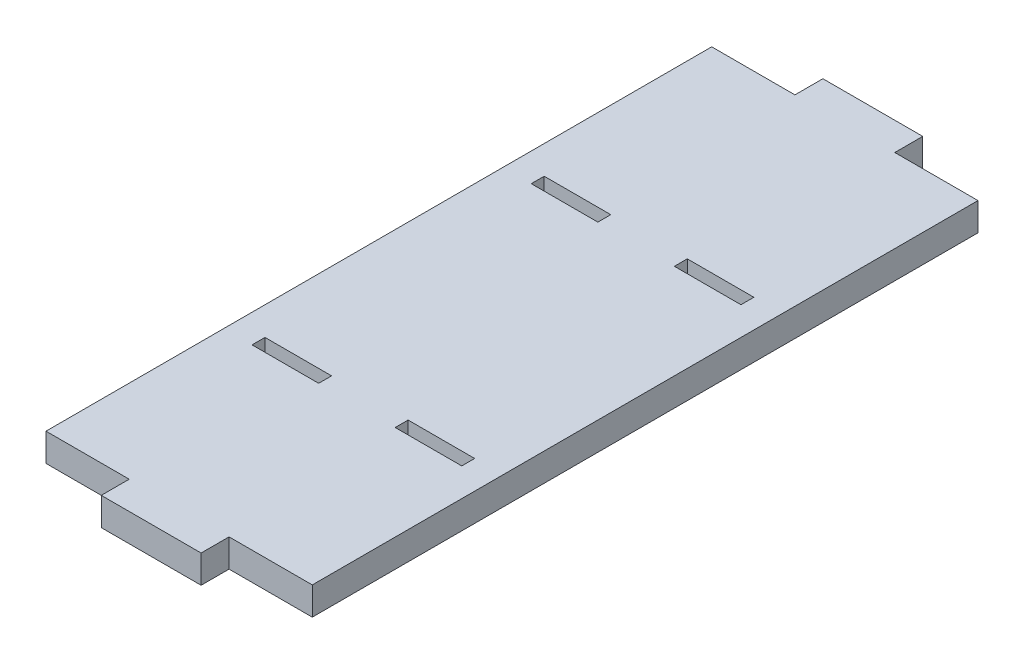
ISO-10303-21;
HEADER;
FILE_DESCRIPTION(('STEP AP214'),'2;1');
FILE_NAME('part.step','',(''),(''),'','','');
FILE_SCHEMA(('AUTOMOTIVE_DESIGN { 1 0 10303 214 1 1 1 1 }'));
ENDSEC;
DATA;
#1=APPLICATION_CONTEXT('core data for automotive mechanical design processes');
#2=APPLICATION_PROTOCOL_DEFINITION('international standard','automotive_design',2000,#1);
#3=PRODUCT_CONTEXT('',#1,'mechanical');
#4=PRODUCT('Part','Part','',(#3));
#5=PRODUCT_RELATED_PRODUCT_CATEGORY('part','',(#4));
#6=PRODUCT_DEFINITION_FORMATION('','',#4);
#7=PRODUCT_DEFINITION_CONTEXT('part definition',#1,'design');
#8=PRODUCT_DEFINITION('design','',#6,#7);
#9=PRODUCT_DEFINITION_SHAPE('','',#8);
#10=(LENGTH_UNIT() NAMED_UNIT(*) SI_UNIT(.MILLI.,.METRE.));
#11=(NAMED_UNIT(*) PLANE_ANGLE_UNIT() SI_UNIT($,.RADIAN.));
#12=(NAMED_UNIT(*) SI_UNIT($,.STERADIAN.) SOLID_ANGLE_UNIT());
#13=UNCERTAINTY_MEASURE_WITH_UNIT(LENGTH_MEASURE(1.E-05),#10,'distance_accuracy_value','');
#14=(GEOMETRIC_REPRESENTATION_CONTEXT(3) GLOBAL_UNCERTAINTY_ASSIGNED_CONTEXT((#13)) GLOBAL_UNIT_ASSIGNED_CONTEXT((#10,
#11,#12)) REPRESENTATION_CONTEXT('',''));
#15=CARTESIAN_POINT('',(0.,0.,0.));
#16=DIRECTION('',(0.,0.,1.));
#17=DIRECTION('',(1.,0.,0.));
#18=AXIS2_PLACEMENT_3D('',#15,#16,#17);
#19=CARTESIAN_POINT('',(0.,5.334,-127.));
#20=DIRECTION('',(0.,0.,1.));
#21=DIRECTION('',(1.,0.,0.));
#22=AXIS2_PLACEMENT_3D('',#19,#20,#21);
#23=PLANE('',#22);
#24=DIRECTION('',(-1.,0.,0.));
#25=VECTOR('',#24,1.);
#26=CARTESIAN_POINT('',(0.,5.334,-127.));
#27=LINE('',#26,#25);
#28=CARTESIAN_POINT('',(15.875,5.334,-127.));
#29=VERTEX_POINT('',#28);
#30=CARTESIAN_POINT('',(0.,5.334,-127.));
#31=VERTEX_POINT('',#30);
#32=EDGE_CURVE('E407',#29,#31,#27,.T.);
#33=ORIENTED_EDGE('',*,*,#32,.F.);
#34=DIRECTION('',(0.,-1.,0.));
#35=VECTOR('',#34,1.);
#36=CARTESIAN_POINT('',(15.875,0.,-127.));
#37=LINE('',#36,#35);
#38=CARTESIAN_POINT('',(15.875,0.,-127.));
#39=VERTEX_POINT('',#38);
#40=EDGE_CURVE('E352',#29,#39,#37,.T.);
#41=ORIENTED_EDGE('',*,*,#40,.T.);
#42=DIRECTION('',(-1.,0.,0.));
#43=VECTOR('',#42,1.);
#44=CARTESIAN_POINT('',(0.,0.,-127.));
#45=LINE('',#44,#43);
#46=CARTESIAN_POINT('',(0.,0.,-127.));
#47=VERTEX_POINT('',#46);
#48=EDGE_CURVE('E405',#39,#47,#45,.T.);
#49=ORIENTED_EDGE('',*,*,#48,.T.);
#50=DIRECTION('',(0.,-1.,0.));
#51=VECTOR('',#50,1.);
#52=CARTESIAN_POINT('',(0.,5.334,-127.));
#53=LINE('',#52,#51);
#54=EDGE_CURVE('E427',#31,#47,#53,.T.);
#55=ORIENTED_EDGE('',*,*,#54,.F.);
#56=EDGE_LOOP('',(#33,#41,#49,#55));
#57=FACE_BOUND('',#56,.T.);
#58=ADVANCED_FACE('F32',(#57),#23,.F.);
#59=CARTESIAN_POINT('',(0.,5.334,0.));
#60=DIRECTION('',(0.,0.,-1.));
#61=DIRECTION('',(-1.,0.,0.));
#62=AXIS2_PLACEMENT_3D('',#59,#60,#61);
#63=PLANE('',#62);
#64=DIRECTION('',(0.,-1.,0.));
#65=VECTOR('',#64,1.);
#66=CARTESIAN_POINT('',(15.875,0.,0.));
#67=LINE('',#66,#65);
#68=CARTESIAN_POINT('',(15.875,5.334,0.));
#69=VERTEX_POINT('',#68);
#70=CARTESIAN_POINT('',(15.875,0.,0.));
#71=VERTEX_POINT('',#70);
#72=EDGE_CURVE('E377',#69,#71,#67,.T.);
#73=ORIENTED_EDGE('',*,*,#72,.F.);
#74=DIRECTION('',(1.,0.,0.));
#75=VECTOR('',#74,1.);
#76=CARTESIAN_POINT('',(0.,5.334,0.));
#77=LINE('',#76,#75);
#78=CARTESIAN_POINT('',(0.,5.334,0.));
#79=VERTEX_POINT('',#78);
#80=EDGE_CURVE('E449',#79,#69,#77,.T.);
#81=ORIENTED_EDGE('',*,*,#80,.F.);
#82=DIRECTION('',(0.,-1.,0.));
#83=VECTOR('',#82,1.);
#84=CARTESIAN_POINT('',(0.,5.334,0.));
#85=LINE('',#84,#83);
#86=CARTESIAN_POINT('',(0.,0.,0.));
#87=VERTEX_POINT('',#86);
#88=EDGE_CURVE('E11',#79,#87,#85,.T.);
#89=ORIENTED_EDGE('',*,*,#88,.T.);
#90=DIRECTION('',(1.,0.,0.));
#91=VECTOR('',#90,1.);
#92=CARTESIAN_POINT('',(0.,0.,0.));
#93=LINE('',#92,#91);
#94=EDGE_CURVE('E417',#87,#71,#93,.T.);
#95=ORIENTED_EDGE('',*,*,#94,.T.);
#96=EDGE_LOOP('',(#73,#81,#89,#95));
#97=FACE_BOUND('',#96,.T.);
#98=ADVANCED_FACE('F523',(#97),#63,.F.);
#99=DIRECTION('',(0.,1.,0.));
#100=VECTOR('',#99,1.);
#101=CARTESIAN_POINT('',(34.925,0.,0.));
#102=LINE('',#101,#100);
#103=CARTESIAN_POINT('',(34.925,0.,0.));
#104=VERTEX_POINT('',#103);
#105=CARTESIAN_POINT('',(34.925,5.334,0.));
#106=VERTEX_POINT('',#105);
#107=EDGE_CURVE('E382',#104,#106,#102,.T.);
#108=ORIENTED_EDGE('',*,*,#107,.F.);
#109=CARTESIAN_POINT('',(50.8,0.,0.));
#110=VERTEX_POINT('',#109);
#111=EDGE_CURVE('E436',#104,#110,#93,.T.);
#112=ORIENTED_EDGE('',*,*,#111,.T.);
#113=DIRECTION('',(0.,-1.,0.));
#114=VECTOR('',#113,1.);
#115=CARTESIAN_POINT('',(50.8,5.334,0.));
#116=LINE('',#115,#114);
#117=CARTESIAN_POINT('',(50.8,5.334,0.));
#118=VERTEX_POINT('',#117);
#119=EDGE_CURVE('E41',#118,#110,#116,.T.);
#120=ORIENTED_EDGE('',*,*,#119,.F.);
#121=EDGE_CURVE('E453',#106,#118,#77,.T.);
#122=ORIENTED_EDGE('',*,*,#121,.F.);
#123=EDGE_LOOP('',(#108,#112,#120,#122));
#124=FACE_BOUND('',#123,.T.);
#125=ADVANCED_FACE('F527',(#124),#63,.F.);
#126=CARTESIAN_POINT('',(0.,5.334,0.));
#127=DIRECTION('',(1.,0.,0.));
#128=DIRECTION('',(0.,0.,-1.));
#129=AXIS2_PLACEMENT_3D('',#126,#127,#128);
#130=PLANE('',#129);
#131=DIRECTION('',(0.,0.,1.));
#132=VECTOR('',#131,1.);
#133=CARTESIAN_POINT('',(0.,0.,0.));
#134=LINE('',#133,#132);
#135=EDGE_CURVE('E410',#47,#87,#134,.T.);
#136=ORIENTED_EDGE('',*,*,#135,.T.);
#137=ORIENTED_EDGE('',*,*,#88,.F.);
#138=DIRECTION('',(0.,0.,1.));
#139=VECTOR('',#138,1.);
#140=CARTESIAN_POINT('',(0.,5.334,0.));
#141=LINE('',#140,#139);
#142=EDGE_CURVE('E415',#31,#79,#141,.T.);
#143=ORIENTED_EDGE('',*,*,#142,.F.);
#144=ORIENTED_EDGE('',*,*,#54,.T.);
#145=EDGE_LOOP('',(#136,#137,#143,#144));
#146=FACE_BOUND('',#145,.T.);
#147=ADVANCED_FACE('F34',(#146),#130,.F.);
#148=CARTESIAN_POINT('',(50.8,5.334,0.));
#149=DIRECTION('',(-1.,0.,0.));
#150=DIRECTION('',(0.,0.,1.));
#151=AXIS2_PLACEMENT_3D('',#148,#149,#150);
#152=PLANE('',#151);
#153=DIRECTION('',(0.,0.,-1.));
#154=VECTOR('',#153,1.);
#155=CARTESIAN_POINT('',(50.8,0.,0.));
#156=LINE('',#155,#154);
#157=CARTESIAN_POINT('',(50.8,0.,-127.));
#158=VERTEX_POINT('',#157);
#159=EDGE_CURVE('E412',#110,#158,#156,.T.);
#160=ORIENTED_EDGE('',*,*,#159,.T.);
#161=DIRECTION('',(0.,-1.,0.));
#162=VECTOR('',#161,1.);
#163=CARTESIAN_POINT('',(50.8,5.334,-127.));
#164=LINE('',#163,#162);
#165=CARTESIAN_POINT('',(50.8,5.334,-127.));
#166=VERTEX_POINT('',#165);
#167=EDGE_CURVE('E430',#166,#158,#164,.T.);
#168=ORIENTED_EDGE('',*,*,#167,.F.);
#169=DIRECTION('',(0.,0.,-1.));
#170=VECTOR('',#169,1.);
#171=CARTESIAN_POINT('',(50.8,5.334,0.));
#172=LINE('',#171,#170);
#173=EDGE_CURVE('E444',#118,#166,#172,.T.);
#174=ORIENTED_EDGE('',*,*,#173,.F.);
#175=ORIENTED_EDGE('',*,*,#119,.T.);
#176=EDGE_LOOP('',(#160,#168,#174,#175));
#177=FACE_BOUND('',#176,.T.);
#178=ADVANCED_FACE('F517',(#177),#152,.F.);
#179=CARTESIAN_POINT('',(34.925,0.,-127.));
#180=VERTEX_POINT('',#179);
#181=EDGE_CURVE('E411',#158,#180,#45,.T.);
#182=ORIENTED_EDGE('',*,*,#181,.T.);
#183=DIRECTION('',(0.,1.,0.));
#184=VECTOR('',#183,1.);
#185=CARTESIAN_POINT('',(34.925,0.,-127.));
#186=LINE('',#185,#184);
#187=CARTESIAN_POINT('',(34.925,5.334,-127.));
#188=VERTEX_POINT('',#187);
#189=EDGE_CURVE('E357',#180,#188,#186,.T.);
#190=ORIENTED_EDGE('',*,*,#189,.T.);
#191=EDGE_CURVE('E422',#166,#188,#27,.T.);
#192=ORIENTED_EDGE('',*,*,#191,.F.);
#193=ORIENTED_EDGE('',*,*,#167,.T.);
#194=EDGE_LOOP('',(#182,#190,#192,#193));
#195=FACE_BOUND('',#194,.T.);
#196=ADVANCED_FACE('F509',(#195),#23,.F.);
#197=CARTESIAN_POINT('',(0.,5.334,0.));
#198=DIRECTION('',(0.,-1.,0.));
#199=DIRECTION('',(0.,0.,-1.));
#200=AXIS2_PLACEMENT_3D('',#197,#198,#199);
#201=PLANE('',#200);
#202=DIRECTION('',(0.,0.,-1.));
#203=VECTOR('',#202,1.);
#204=CARTESIAN_POINT('',(32.7,5.334,0.));
#205=LINE('',#204,#203);
#206=CARTESIAN_POINT('',(32.7,5.334,-87.1773534988727));
#207=VERTEX_POINT('',#206);
#208=CARTESIAN_POINT('',(32.7,5.334,-89.6411534988727));
#209=VERTEX_POINT('',#208);
#210=EDGE_CURVE('E250',#207,#209,#205,.T.);
#211=ORIENTED_EDGE('',*,*,#210,.T.);
#212=DIRECTION('',(1.,0.,0.));
#213=VECTOR('',#212,1.);
#214=CARTESIAN_POINT('',(0.,5.334,-89.6411534988727));
#215=LINE('',#214,#213);
#216=CARTESIAN_POINT('',(45.4,5.334,-89.6411534988727));
#217=VERTEX_POINT('',#216);
#218=EDGE_CURVE('E253',#209,#217,#215,.T.);
#219=ORIENTED_EDGE('',*,*,#218,.T.);
#220=DIRECTION('',(0.,0.,1.));
#221=VECTOR('',#220,1.);
#222=CARTESIAN_POINT('',(45.4,5.334,0.));
#223=LINE('',#222,#221);
#224=CARTESIAN_POINT('',(45.4,5.334,-87.1773534988727));
#225=VERTEX_POINT('',#224);
#226=EDGE_CURVE('E245',#217,#225,#223,.T.);
#227=ORIENTED_EDGE('',*,*,#226,.T.);
#228=DIRECTION('',(-1.,0.,0.));
#229=VECTOR('',#228,1.);
#230=CARTESIAN_POINT('',(0.,5.334,-87.1773534988727));
#231=LINE('',#230,#229);
#232=EDGE_CURVE('E225',#225,#207,#231,.T.);
#233=ORIENTED_EDGE('',*,*,#232,.T.);
#234=EDGE_LOOP('',(#211,#219,#227,#233));
#235=FACE_BOUND('',#234,.T.);
#236=DIRECTION('',(0.,0.,1.));
#237=VECTOR('',#236,1.);
#238=CARTESIAN_POINT('',(18.1,5.334,0.));
#239=LINE('',#238,#237);
#240=CARTESIAN_POINT('',(18.1,5.334,-89.6411534988727));
#241=VERTEX_POINT('',#240);
#242=CARTESIAN_POINT('',(18.1,5.334,-87.1773534988727));
#243=VERTEX_POINT('',#242);
#244=EDGE_CURVE('E282',#241,#243,#239,.T.);
#245=ORIENTED_EDGE('',*,*,#244,.T.);
#246=DIRECTION('',(-1.,0.,0.));
#247=VECTOR('',#246,1.);
#248=CARTESIAN_POINT('',(0.,5.334,-87.1773534988727));
#249=LINE('',#248,#247);
#250=CARTESIAN_POINT('',(5.39999999999997,5.334,-87.1773534988727));
#251=VERTEX_POINT('',#250);
#252=EDGE_CURVE('E285',#243,#251,#249,.T.);
#253=ORIENTED_EDGE('',*,*,#252,.T.);
#254=DIRECTION('',(0.,0.,-1.));
#255=VECTOR('',#254,1.);
#256=CARTESIAN_POINT('',(5.39999999999997,5.334,0.));
#257=LINE('',#256,#255);
#258=CARTESIAN_POINT('',(5.39999999999997,5.334,-89.6411534988727));
#259=VERTEX_POINT('',#258);
#260=EDGE_CURVE('E270',#251,#259,#257,.T.);
#261=ORIENTED_EDGE('',*,*,#260,.T.);
#262=DIRECTION('',(1.,0.,0.));
#263=VECTOR('',#262,1.);
#264=CARTESIAN_POINT('',(0.,5.334,-89.6411534988727));
#265=LINE('',#264,#263);
#266=EDGE_CURVE('E279',#259,#241,#265,.T.);
#267=ORIENTED_EDGE('',*,*,#266,.T.);
#268=EDGE_LOOP('',(#245,#253,#261,#267));
#269=FACE_BOUND('',#268,.T.);
#270=DIRECTION('',(0.,0.,-1.));
#271=VECTOR('',#270,1.);
#272=CARTESIAN_POINT('',(32.7,5.334,0.));
#273=LINE('',#272,#271);
#274=CARTESIAN_POINT('',(32.7,5.334,-33.9135534988727));
#275=VERTEX_POINT('',#274);
#276=CARTESIAN_POINT('',(32.7,5.334,-36.3773534988727));
#277=VERTEX_POINT('',#276);
#278=EDGE_CURVE('E314',#275,#277,#273,.T.);
#279=ORIENTED_EDGE('',*,*,#278,.T.);
#280=DIRECTION('',(1.,0.,0.));
#281=VECTOR('',#280,1.);
#282=CARTESIAN_POINT('',(0.,5.334,-36.3773534988727));
#283=LINE('',#282,#281);
#284=CARTESIAN_POINT('',(45.4,5.334,-36.3773534988727));
#285=VERTEX_POINT('',#284);
#286=EDGE_CURVE('E317',#277,#285,#283,.T.);
#287=ORIENTED_EDGE('',*,*,#286,.T.);
#288=DIRECTION('',(0.,0.,1.));
#289=VECTOR('',#288,1.);
#290=CARTESIAN_POINT('',(45.4,5.334,0.));
#291=LINE('',#290,#289);
#292=CARTESIAN_POINT('',(45.4,5.334,-33.9135534988727));
#293=VERTEX_POINT('',#292);
#294=EDGE_CURVE('E302',#285,#293,#291,.T.);
#295=ORIENTED_EDGE('',*,*,#294,.T.);
#296=DIRECTION('',(-1.,0.,0.));
#297=VECTOR('',#296,1.);
#298=CARTESIAN_POINT('',(0.,5.334,-33.9135534988727));
#299=LINE('',#298,#297);
#300=EDGE_CURVE('E311',#293,#275,#299,.T.);
#301=ORIENTED_EDGE('',*,*,#300,.T.);
#302=EDGE_LOOP('',(#279,#287,#295,#301));
#303=FACE_BOUND('',#302,.T.);
#304=DIRECTION('',(0.,0.,1.));
#305=VECTOR('',#304,1.);
#306=CARTESIAN_POINT('',(18.1,5.334,0.));
#307=LINE('',#306,#305);
#308=CARTESIAN_POINT('',(18.1,5.334,-36.3773534988727));
#309=VERTEX_POINT('',#308);
#310=CARTESIAN_POINT('',(18.1,5.334,-33.9135534988727));
#311=VERTEX_POINT('',#310);
#312=EDGE_CURVE('E346',#309,#311,#307,.T.);
#313=ORIENTED_EDGE('',*,*,#312,.T.);
#314=DIRECTION('',(-1.,0.,0.));
#315=VECTOR('',#314,1.);
#316=CARTESIAN_POINT('',(0.,5.334,-33.9135534988727));
#317=LINE('',#316,#315);
#318=CARTESIAN_POINT('',(5.39999999999998,5.334,-33.9135534988727));
#319=VERTEX_POINT('',#318);
#320=EDGE_CURVE('E349',#311,#319,#317,.T.);
#321=ORIENTED_EDGE('',*,*,#320,.T.);
#322=DIRECTION('',(0.,0.,-1.));
#323=VECTOR('',#322,1.);
#324=CARTESIAN_POINT('',(5.39999999999998,5.334,0.));
#325=LINE('',#324,#323);
#326=CARTESIAN_POINT('',(5.39999999999998,5.334,-36.3773534988727));
#327=VERTEX_POINT('',#326);
#328=EDGE_CURVE('E334',#319,#327,#325,.T.);
#329=ORIENTED_EDGE('',*,*,#328,.T.);
#330=DIRECTION('',(1.,0.,0.));
#331=VECTOR('',#330,1.);
#332=CARTESIAN_POINT('',(0.,5.334,-36.3773534988727));
#333=LINE('',#332,#331);
#334=EDGE_CURVE('E343',#327,#309,#333,.T.);
#335=ORIENTED_EDGE('',*,*,#334,.T.);
#336=EDGE_LOOP('',(#313,#321,#329,#335));
#337=FACE_BOUND('',#336,.T.);
#338=ORIENTED_EDGE('',*,*,#142,.T.);
#339=ORIENTED_EDGE('',*,*,#80,.T.);
#340=DIRECTION('',(0.,0.,-1.));
#341=VECTOR('',#340,1.);
#342=CARTESIAN_POINT('',(15.875,5.334,5.334));
#343=LINE('',#342,#341);
#344=CARTESIAN_POINT('',(15.875,5.334,5.334));
#345=VERTEX_POINT('',#344);
#346=EDGE_CURVE('E473',#345,#69,#343,.T.);
#347=ORIENTED_EDGE('',*,*,#346,.F.);
#348=DIRECTION('',(-1.,0.,0.));
#349=VECTOR('',#348,1.);
#350=CARTESIAN_POINT('',(15.875,5.334,5.334));
#351=LINE('',#350,#349);
#352=CARTESIAN_POINT('',(34.925,5.334,5.334));
#353=VERTEX_POINT('',#352);
#354=EDGE_CURVE('E484',#353,#345,#351,.T.);
#355=ORIENTED_EDGE('',*,*,#354,.F.);
#356=DIRECTION('',(0.,0.,-1.));
#357=VECTOR('',#356,1.);
#358=CARTESIAN_POINT('',(34.925,5.334,5.334));
#359=LINE('',#358,#357);
#360=EDGE_CURVE('E469',#353,#106,#359,.T.);
#361=ORIENTED_EDGE('',*,*,#360,.T.);
#362=ORIENTED_EDGE('',*,*,#121,.T.);
#363=ORIENTED_EDGE('',*,*,#173,.T.);
#364=ORIENTED_EDGE('',*,*,#191,.T.);
#365=DIRECTION('',(0.,0.,1.));
#366=VECTOR('',#365,1.);
#367=CARTESIAN_POINT('',(34.925,5.334,-132.334));
#368=LINE('',#367,#366);
#369=CARTESIAN_POINT('',(34.925,5.334,-132.334));
#370=VERTEX_POINT('',#369);
#371=EDGE_CURVE('E378',#370,#188,#368,.T.);
#372=ORIENTED_EDGE('',*,*,#371,.F.);
#373=DIRECTION('',(-1.,0.,0.));
#374=VECTOR('',#373,1.);
#375=CARTESIAN_POINT('',(15.875,5.334,-132.334));
#376=LINE('',#375,#374);
#377=CARTESIAN_POINT('',(15.875,5.334,-132.334));
#378=VERTEX_POINT('',#377);
#379=EDGE_CURVE('E356',#370,#378,#376,.T.);
#380=ORIENTED_EDGE('',*,*,#379,.T.);
#381=DIRECTION('',(0.,0.,1.));
#382=VECTOR('',#381,1.);
#383=CARTESIAN_POINT('',(15.875,5.334,-132.334));
#384=LINE('',#383,#382);
#385=EDGE_CURVE('E376',#378,#29,#384,.T.);
#386=ORIENTED_EDGE('',*,*,#385,.T.);
#387=ORIENTED_EDGE('',*,*,#32,.T.);
#388=EDGE_LOOP('',(#338,#339,#347,#355,#361,#362,#363,#364,#372,#380,#386,#387));
#389=FACE_BOUND('',#388,.T.);
#390=ADVANCED_FACE('F505',(#235,#269,#303,#337,#389),#201,.F.);
#391=CARTESIAN_POINT('',(0.,0.,0.));
#392=DIRECTION('',(0.,-1.,0.));
#393=DIRECTION('',(0.,0.,-1.));
#394=AXIS2_PLACEMENT_3D('',#391,#392,#393);
#395=PLANE('',#394);
#396=DIRECTION('',(1.,0.,0.));
#397=VECTOR('',#396,1.);
#398=CARTESIAN_POINT('',(32.7,0.,-89.6411534988727));
#399=LINE('',#398,#397);
#400=CARTESIAN_POINT('',(32.7,0.,-89.6411534988727));
#401=VERTEX_POINT('',#400);
#402=CARTESIAN_POINT('',(45.4,0.,-89.6411534988727));
#403=VERTEX_POINT('',#402);
#404=EDGE_CURVE('E57',#401,#403,#399,.T.);
#405=ORIENTED_EDGE('',*,*,#404,.F.);
#406=DIRECTION('',(0.,0.,-1.));
#407=VECTOR('',#406,1.);
#408=CARTESIAN_POINT('',(32.7,0.,-87.1773534988727));
#409=LINE('',#408,#407);
#410=CARTESIAN_POINT('',(32.7,0.,-87.1773534988727));
#411=VERTEX_POINT('',#410);
#412=EDGE_CURVE('E238',#411,#401,#409,.T.);
#413=ORIENTED_EDGE('',*,*,#412,.F.);
#414=DIRECTION('',(-1.,0.,0.));
#415=VECTOR('',#414,1.);
#416=CARTESIAN_POINT('',(45.4,0.,-87.1773534988727));
#417=LINE('',#416,#415);
#418=CARTESIAN_POINT('',(45.4,0.,-87.1773534988727));
#419=VERTEX_POINT('',#418);
#420=EDGE_CURVE('E222',#419,#411,#417,.T.);
#421=ORIENTED_EDGE('',*,*,#420,.F.);
#422=DIRECTION('',(0.,0.,1.));
#423=VECTOR('',#422,1.);
#424=CARTESIAN_POINT('',(45.4,0.,-89.6411534988727));
#425=LINE('',#424,#423);
#426=EDGE_CURVE('E231',#403,#419,#425,.T.);
#427=ORIENTED_EDGE('',*,*,#426,.F.);
#428=EDGE_LOOP('',(#405,#413,#421,#427));
#429=FACE_BOUND('',#428,.T.);
#430=DIRECTION('',(-1.,0.,0.));
#431=VECTOR('',#430,1.);
#432=CARTESIAN_POINT('',(18.1,0.,-87.1773534988727));
#433=LINE('',#432,#431);
#434=CARTESIAN_POINT('',(18.1,0.,-87.1773534988727));
#435=VERTEX_POINT('',#434);
#436=CARTESIAN_POINT('',(5.39999999999997,0.,-87.1773534988727));
#437=VERTEX_POINT('',#436);
#438=EDGE_CURVE('E256',#435,#437,#433,.T.);
#439=ORIENTED_EDGE('',*,*,#438,.F.);
#440=DIRECTION('',(0.,0.,1.));
#441=VECTOR('',#440,1.);
#442=CARTESIAN_POINT('',(18.1,0.,-89.6411534988727));
#443=LINE('',#442,#441);
#444=CARTESIAN_POINT('',(18.1,0.,-89.6411534988727));
#445=VERTEX_POINT('',#444);
#446=EDGE_CURVE('E264',#445,#435,#443,.T.);
#447=ORIENTED_EDGE('',*,*,#446,.F.);
#448=DIRECTION('',(1.,0.,0.));
#449=VECTOR('',#448,1.);
#450=CARTESIAN_POINT('',(5.39999999999997,0.,-89.6411534988727));
#451=LINE('',#450,#449);
#452=CARTESIAN_POINT('',(5.39999999999997,0.,-89.6411534988727));
#453=VERTEX_POINT('',#452);
#454=EDGE_CURVE('E261',#453,#445,#451,.T.);
#455=ORIENTED_EDGE('',*,*,#454,.F.);
#456=DIRECTION('',(0.,0.,-1.));
#457=VECTOR('',#456,1.);
#458=CARTESIAN_POINT('',(5.39999999999997,0.,-87.1773534988727));
#459=LINE('',#458,#457);
#460=EDGE_CURVE('E258',#437,#453,#459,.T.);
#461=ORIENTED_EDGE('',*,*,#460,.F.);
#462=EDGE_LOOP('',(#439,#447,#455,#461));
#463=FACE_BOUND('',#462,.T.);
#464=DIRECTION('',(1.,0.,0.));
#465=VECTOR('',#464,1.);
#466=CARTESIAN_POINT('',(32.7,0.,-36.3773534988727));
#467=LINE('',#466,#465);
#468=CARTESIAN_POINT('',(32.7,0.,-36.3773534988727));
#469=VERTEX_POINT('',#468);
#470=CARTESIAN_POINT('',(45.4,0.,-36.3773534988727));
#471=VERTEX_POINT('',#470);
#472=EDGE_CURVE('E288',#469,#471,#467,.T.);
#473=ORIENTED_EDGE('',*,*,#472,.F.);
#474=DIRECTION('',(0.,0.,-1.));
#475=VECTOR('',#474,1.);
#476=CARTESIAN_POINT('',(32.7,0.,-33.9135534988727));
#477=LINE('',#476,#475);
#478=CARTESIAN_POINT('',(32.7,0.,-33.9135534988727));
#479=VERTEX_POINT('',#478);
#480=EDGE_CURVE('E296',#479,#469,#477,.T.);
#481=ORIENTED_EDGE('',*,*,#480,.F.);
#482=DIRECTION('',(-1.,0.,0.));
#483=VECTOR('',#482,1.);
#484=CARTESIAN_POINT('',(45.4,0.,-33.9135534988727));
#485=LINE('',#484,#483);
#486=CARTESIAN_POINT('',(45.4,0.,-33.9135534988727));
#487=VERTEX_POINT('',#486);
#488=EDGE_CURVE('E293',#487,#479,#485,.T.);
#489=ORIENTED_EDGE('',*,*,#488,.F.);
#490=DIRECTION('',(0.,0.,1.));
#491=VECTOR('',#490,1.);
#492=CARTESIAN_POINT('',(45.4,0.,-36.3773534988727));
#493=LINE('',#492,#491);
#494=EDGE_CURVE('E290',#471,#487,#493,.T.);
#495=ORIENTED_EDGE('',*,*,#494,.F.);
#496=EDGE_LOOP('',(#473,#481,#489,#495));
#497=FACE_BOUND('',#496,.T.);
#498=DIRECTION('',(-1.,0.,0.));
#499=VECTOR('',#498,1.);
#500=CARTESIAN_POINT('',(18.1,0.,-33.9135534988727));
#501=LINE('',#500,#499);
#502=CARTESIAN_POINT('',(18.1,0.,-33.9135534988727));
#503=VERTEX_POINT('',#502);
#504=CARTESIAN_POINT('',(5.39999999999998,0.,-33.9135534988727));
#505=VERTEX_POINT('',#504);
#506=EDGE_CURVE('E320',#503,#505,#501,.T.);
#507=ORIENTED_EDGE('',*,*,#506,.F.);
#508=DIRECTION('',(0.,0.,1.));
#509=VECTOR('',#508,1.);
#510=CARTESIAN_POINT('',(18.1,0.,-36.3773534988727));
#511=LINE('',#510,#509);
#512=CARTESIAN_POINT('',(18.1,0.,-36.3773534988727));
#513=VERTEX_POINT('',#512);
#514=EDGE_CURVE('E328',#513,#503,#511,.T.);
#515=ORIENTED_EDGE('',*,*,#514,.F.);
#516=DIRECTION('',(1.,0.,0.));
#517=VECTOR('',#516,1.);
#518=CARTESIAN_POINT('',(5.39999999999998,0.,-36.3773534988727));
#519=LINE('',#518,#517);
#520=CARTESIAN_POINT('',(5.39999999999998,0.,-36.3773534988727));
#521=VERTEX_POINT('',#520);
#522=EDGE_CURVE('E325',#521,#513,#519,.T.);
#523=ORIENTED_EDGE('',*,*,#522,.F.);
#524=DIRECTION('',(0.,0.,-1.));
#525=VECTOR('',#524,1.);
#526=CARTESIAN_POINT('',(5.39999999999998,0.,-33.9135534988727));
#527=LINE('',#526,#525);
#528=EDGE_CURVE('E322',#505,#521,#527,.T.);
#529=ORIENTED_EDGE('',*,*,#528,.F.);
#530=EDGE_LOOP('',(#507,#515,#523,#529));
#531=FACE_BOUND('',#530,.T.);
#532=ORIENTED_EDGE('',*,*,#135,.F.);
#533=ORIENTED_EDGE('',*,*,#48,.F.);
#534=DIRECTION('',(0.,0.,1.));
#535=VECTOR('',#534,1.);
#536=CARTESIAN_POINT('',(15.875,0.,-132.334));
#537=LINE('',#536,#535);
#538=CARTESIAN_POINT('',(15.875,0.,-132.334));
#539=VERTEX_POINT('',#538);
#540=EDGE_CURVE('E366',#539,#39,#537,.T.);
#541=ORIENTED_EDGE('',*,*,#540,.F.);
#542=DIRECTION('',(1.,0.,0.));
#543=VECTOR('',#542,1.);
#544=CARTESIAN_POINT('',(15.875,0.,-132.334));
#545=LINE('',#544,#543);
#546=CARTESIAN_POINT('',(34.925,0.,-132.334));
#547=VERTEX_POINT('',#546);
#548=EDGE_CURVE('E363',#539,#547,#545,.T.);
#549=ORIENTED_EDGE('',*,*,#548,.T.);
#550=DIRECTION('',(0.,0.,1.));
#551=VECTOR('',#550,1.);
#552=CARTESIAN_POINT('',(34.925,0.,-132.334));
#553=LINE('',#552,#551);
#554=EDGE_CURVE('E384',#547,#180,#553,.T.);
#555=ORIENTED_EDGE('',*,*,#554,.T.);
#556=ORIENTED_EDGE('',*,*,#181,.F.);
#557=ORIENTED_EDGE('',*,*,#159,.F.);
#558=ORIENTED_EDGE('',*,*,#111,.F.);
#559=DIRECTION('',(0.,0.,-1.));
#560=VECTOR('',#559,1.);
#561=CARTESIAN_POINT('',(34.925,0.,5.334));
#562=LINE('',#561,#560);
#563=CARTESIAN_POINT('',(34.925,0.,5.334));
#564=VERTEX_POINT('',#563);
#565=EDGE_CURVE('E472',#564,#104,#562,.T.);
#566=ORIENTED_EDGE('',*,*,#565,.F.);
#567=DIRECTION('',(1.,0.,0.));
#568=VECTOR('',#567,1.);
#569=CARTESIAN_POINT('',(15.875,0.,5.334));
#570=LINE('',#569,#568);
#571=CARTESIAN_POINT('',(15.875,0.,5.334));
#572=VERTEX_POINT('',#571);
#573=EDGE_CURVE('E492',#572,#564,#570,.T.);
#574=ORIENTED_EDGE('',*,*,#573,.F.);
#575=DIRECTION('',(0.,0.,-1.));
#576=VECTOR('',#575,1.);
#577=CARTESIAN_POINT('',(15.875,0.,5.334));
#578=LINE('',#577,#576);
#579=EDGE_CURVE('E441',#572,#71,#578,.T.);
#580=ORIENTED_EDGE('',*,*,#579,.T.);
#581=ORIENTED_EDGE('',*,*,#94,.F.);
#582=EDGE_LOOP('',(#532,#533,#541,#549,#555,#556,#557,#558,#566,#574,#580,#581));
#583=FACE_BOUND('',#582,.T.);
#584=ADVANCED_FACE('F235',(#429,#463,#497,#531,#583),#395,.T.);
#585=CARTESIAN_POINT('',(15.875,0.,5.334));
#586=DIRECTION('',(1.,0.,0.));
#587=DIRECTION('',(0.,0.,-1.));
#588=AXIS2_PLACEMENT_3D('',#585,#586,#587);
#589=PLANE('',#588);
#590=ORIENTED_EDGE('',*,*,#72,.T.);
#591=ORIENTED_EDGE('',*,*,#579,.F.);
#592=DIRECTION('',(0.,-1.,0.));
#593=VECTOR('',#592,1.);
#594=CARTESIAN_POINT('',(15.875,0.,5.334));
#595=LINE('',#594,#593);
#596=EDGE_CURVE('E468',#345,#572,#595,.T.);
#597=ORIENTED_EDGE('',*,*,#596,.F.);
#598=ORIENTED_EDGE('',*,*,#346,.T.);
#599=EDGE_LOOP('',(#590,#591,#597,#598));
#600=FACE_BOUND('',#599,.T.);
#601=ADVANCED_FACE('F498',(#600),#589,.F.);
#602=CARTESIAN_POINT('',(34.925,0.,5.334));
#603=DIRECTION('',(-1.,0.,0.));
#604=DIRECTION('',(0.,0.,1.));
#605=AXIS2_PLACEMENT_3D('',#602,#603,#604);
#606=PLANE('',#605);
#607=ORIENTED_EDGE('',*,*,#107,.T.);
#608=ORIENTED_EDGE('',*,*,#360,.F.);
#609=DIRECTION('',(0.,1.,0.));
#610=VECTOR('',#609,1.);
#611=CARTESIAN_POINT('',(34.925,0.,5.334));
#612=LINE('',#611,#610);
#613=EDGE_CURVE('E488',#564,#353,#612,.T.);
#614=ORIENTED_EDGE('',*,*,#613,.F.);
#615=ORIENTED_EDGE('',*,*,#565,.T.);
#616=EDGE_LOOP('',(#607,#608,#614,#615));
#617=FACE_BOUND('',#616,.T.);
#618=ADVANCED_FACE('F504',(#617),#606,.F.);
#619=CARTESIAN_POINT('',(0.,0.,5.334));
#620=DIRECTION('',(0.,0.,-1.));
#621=DIRECTION('',(-1.,0.,0.));
#622=AXIS2_PLACEMENT_3D('',#619,#620,#621);
#623=PLANE('',#622);
#624=ORIENTED_EDGE('',*,*,#596,.T.);
#625=ORIENTED_EDGE('',*,*,#573,.T.);
#626=ORIENTED_EDGE('',*,*,#613,.T.);
#627=ORIENTED_EDGE('',*,*,#354,.T.);
#628=EDGE_LOOP('',(#624,#625,#626,#627));
#629=FACE_BOUND('',#628,.T.);
#630=ADVANCED_FACE('F496',(#629),#623,.F.);
#631=CARTESIAN_POINT('',(15.875,0.,-132.334));
#632=DIRECTION('',(-1.,0.,0.));
#633=DIRECTION('',(0.,0.,1.));
#634=AXIS2_PLACEMENT_3D('',#631,#632,#633);
#635=PLANE('',#634);
#636=ORIENTED_EDGE('',*,*,#40,.F.);
#637=ORIENTED_EDGE('',*,*,#385,.F.);
#638=DIRECTION('',(0.,-1.,0.));
#639=VECTOR('',#638,1.);
#640=CARTESIAN_POINT('',(15.875,0.,-132.334));
#641=LINE('',#640,#639);
#642=EDGE_CURVE('E353',#378,#539,#641,.T.);
#643=ORIENTED_EDGE('',*,*,#642,.T.);
#644=ORIENTED_EDGE('',*,*,#540,.T.);
#645=EDGE_LOOP('',(#636,#637,#643,#644));
#646=FACE_BOUND('',#645,.T.);
#647=ADVANCED_FACE('F397',(#646),#635,.T.);
#648=CARTESIAN_POINT('',(34.925,0.,-132.334));
#649=DIRECTION('',(1.,0.,0.));
#650=DIRECTION('',(0.,0.,-1.));
#651=AXIS2_PLACEMENT_3D('',#648,#649,#650);
#652=PLANE('',#651);
#653=ORIENTED_EDGE('',*,*,#189,.F.);
#654=ORIENTED_EDGE('',*,*,#554,.F.);
#655=DIRECTION('',(0.,1.,0.));
#656=VECTOR('',#655,1.);
#657=CARTESIAN_POINT('',(34.925,0.,-132.334));
#658=LINE('',#657,#656);
#659=EDGE_CURVE('E360',#547,#370,#658,.T.);
#660=ORIENTED_EDGE('',*,*,#659,.T.);
#661=ORIENTED_EDGE('',*,*,#371,.T.);
#662=EDGE_LOOP('',(#653,#654,#660,#661));
#663=FACE_BOUND('',#662,.T.);
#664=ADVANCED_FACE('F540',(#663),#652,.T.);
#665=CARTESIAN_POINT('',(0.,0.,-132.334));
#666=DIRECTION('',(0.,0.,1.));
#667=DIRECTION('',(-1.,0.,0.));
#668=AXIS2_PLACEMENT_3D('',#665,#666,#667);
#669=PLANE('',#668);
#670=ORIENTED_EDGE('',*,*,#642,.F.);
#671=ORIENTED_EDGE('',*,*,#379,.F.);
#672=ORIENTED_EDGE('',*,*,#659,.F.);
#673=ORIENTED_EDGE('',*,*,#548,.F.);
#674=EDGE_LOOP('',(#670,#671,#672,#673));
#675=FACE_BOUND('',#674,.T.);
#676=ADVANCED_FACE('F543',(#675),#669,.F.);
#677=CARTESIAN_POINT('',(18.1,5.33405,-33.9135534988727));
#678=DIRECTION('',(0.,0.,1.));
#679=DIRECTION('',(1.,0.,0.));
#680=AXIS2_PLACEMENT_3D('',#677,#678,#679);
#681=PLANE('',#680);
#682=DIRECTION('',(0.,-1.,0.));
#683=VECTOR('',#682,1.);
#684=CARTESIAN_POINT('',(18.1,5.33405,-33.9135534988727));
#685=LINE('',#684,#683);
#686=EDGE_CURVE('E332',#311,#503,#685,.T.);
#687=ORIENTED_EDGE('',*,*,#686,.T.);
#688=ORIENTED_EDGE('',*,*,#506,.T.);
#689=DIRECTION('',(0.,-1.,0.));
#690=VECTOR('',#689,1.);
#691=CARTESIAN_POINT('',(5.39999999999998,5.33405,-33.9135534988727));
#692=LINE('',#691,#690);
#693=EDGE_CURVE('E331',#319,#505,#692,.T.);
#694=ORIENTED_EDGE('',*,*,#693,.F.);
#695=ORIENTED_EDGE('',*,*,#320,.F.);
#696=EDGE_LOOP('',(#687,#688,#694,#695));
#697=FACE_BOUND('',#696,.T.);
#698=ADVANCED_FACE('F545',(#697),#681,.F.);
#699=CARTESIAN_POINT('',(18.1,5.33405,-36.3773534988727));
#700=DIRECTION('',(1.,0.,0.));
#701=DIRECTION('',(0.,0.,-1.));
#702=AXIS2_PLACEMENT_3D('',#699,#700,#701);
#703=PLANE('',#702);
#704=DIRECTION('',(0.,-1.,0.));
#705=VECTOR('',#704,1.);
#706=CARTESIAN_POINT('',(18.1,5.33405,-36.3773534988727));
#707=LINE('',#706,#705);
#708=EDGE_CURVE('E335',#309,#513,#707,.T.);
#709=ORIENTED_EDGE('',*,*,#708,.T.);
#710=ORIENTED_EDGE('',*,*,#514,.T.);
#711=ORIENTED_EDGE('',*,*,#686,.F.);
#712=ORIENTED_EDGE('',*,*,#312,.F.);
#713=EDGE_LOOP('',(#709,#710,#711,#712));
#714=FACE_BOUND('',#713,.T.);
#715=ADVANCED_FACE('F551',(#714),#703,.F.);
#716=CARTESIAN_POINT('',(5.39999999999998,5.33405,-36.3773534988727));
#717=DIRECTION('',(0.,0.,-1.));
#718=DIRECTION('',(-1.,0.,0.));
#719=AXIS2_PLACEMENT_3D('',#716,#717,#718);
#720=PLANE('',#719);
#721=DIRECTION('',(0.,-1.,0.));
#722=VECTOR('',#721,1.);
#723=CARTESIAN_POINT('',(5.39999999999998,5.33405,-36.3773534988727));
#724=LINE('',#723,#722);
#725=EDGE_CURVE('E337',#327,#521,#724,.T.);
#726=ORIENTED_EDGE('',*,*,#725,.T.);
#727=ORIENTED_EDGE('',*,*,#522,.T.);
#728=ORIENTED_EDGE('',*,*,#708,.F.);
#729=ORIENTED_EDGE('',*,*,#334,.F.);
#730=EDGE_LOOP('',(#726,#727,#728,#729));
#731=FACE_BOUND('',#730,.T.);
#732=ADVANCED_FACE('F615',(#731),#720,.F.);
#733=CARTESIAN_POINT('',(5.39999999999998,5.33405,-33.9135534988727));
#734=DIRECTION('',(-1.,0.,0.));
#735=DIRECTION('',(0.,0.,1.));
#736=AXIS2_PLACEMENT_3D('',#733,#734,#735);
#737=PLANE('',#736);
#738=ORIENTED_EDGE('',*,*,#693,.T.);
#739=ORIENTED_EDGE('',*,*,#528,.T.);
#740=ORIENTED_EDGE('',*,*,#725,.F.);
#741=ORIENTED_EDGE('',*,*,#328,.F.);
#742=EDGE_LOOP('',(#738,#739,#740,#741));
#743=FACE_BOUND('',#742,.T.);
#744=ADVANCED_FACE('F625',(#743),#737,.F.);
#745=CARTESIAN_POINT('',(32.7,5.33405,-36.3773534988727));
#746=DIRECTION('',(0.,0.,-1.));
#747=DIRECTION('',(-1.,0.,0.));
#748=AXIS2_PLACEMENT_3D('',#745,#746,#747);
#749=PLANE('',#748);
#750=DIRECTION('',(0.,-1.,0.));
#751=VECTOR('',#750,1.);
#752=CARTESIAN_POINT('',(32.7,5.33405,-36.3773534988727));
#753=LINE('',#752,#751);
#754=EDGE_CURVE('E300',#277,#469,#753,.T.);
#755=ORIENTED_EDGE('',*,*,#754,.T.);
#756=ORIENTED_EDGE('',*,*,#472,.T.);
#757=DIRECTION('',(0.,-1.,0.));
#758=VECTOR('',#757,1.);
#759=CARTESIAN_POINT('',(45.4,5.33405,-36.3773534988727));
#760=LINE('',#759,#758);
#761=EDGE_CURVE('E299',#285,#471,#760,.T.);
#762=ORIENTED_EDGE('',*,*,#761,.F.);
#763=ORIENTED_EDGE('',*,*,#286,.F.);
#764=EDGE_LOOP('',(#755,#756,#762,#763));
#765=FACE_BOUND('',#764,.T.);
#766=ADVANCED_FACE('F635',(#765),#749,.F.);
#767=CARTESIAN_POINT('',(32.7,5.33405,-33.9135534988727));
#768=DIRECTION('',(-1.,0.,0.));
#769=DIRECTION('',(0.,0.,1.));
#770=AXIS2_PLACEMENT_3D('',#767,#768,#769);
#771=PLANE('',#770);
#772=DIRECTION('',(0.,-1.,0.));
#773=VECTOR('',#772,1.);
#774=CARTESIAN_POINT('',(32.7,5.33405,-33.9135534988727));
#775=LINE('',#774,#773);
#776=EDGE_CURVE('E303',#275,#479,#775,.T.);
#777=ORIENTED_EDGE('',*,*,#776,.T.);
#778=ORIENTED_EDGE('',*,*,#480,.T.);
#779=ORIENTED_EDGE('',*,*,#754,.F.);
#780=ORIENTED_EDGE('',*,*,#278,.F.);
#781=EDGE_LOOP('',(#777,#778,#779,#780));
#782=FACE_BOUND('',#781,.T.);
#783=ADVANCED_FACE('F644',(#782),#771,.F.);
#784=CARTESIAN_POINT('',(45.4,5.33405,-33.9135534988727));
#785=DIRECTION('',(0.,0.,1.));
#786=DIRECTION('',(1.,0.,0.));
#787=AXIS2_PLACEMENT_3D('',#784,#785,#786);
#788=PLANE('',#787);
#789=DIRECTION('',(0.,-1.,0.));
#790=VECTOR('',#789,1.);
#791=CARTESIAN_POINT('',(45.4,5.33405,-33.9135534988727));
#792=LINE('',#791,#790);
#793=EDGE_CURVE('E305',#293,#487,#792,.T.);
#794=ORIENTED_EDGE('',*,*,#793,.T.);
#795=ORIENTED_EDGE('',*,*,#488,.T.);
#796=ORIENTED_EDGE('',*,*,#776,.F.);
#797=ORIENTED_EDGE('',*,*,#300,.F.);
#798=EDGE_LOOP('',(#794,#795,#796,#797));
#799=FACE_BOUND('',#798,.T.);
#800=ADVANCED_FACE('F654',(#799),#788,.F.);
#801=CARTESIAN_POINT('',(45.4,5.33405,-36.3773534988727));
#802=DIRECTION('',(1.,0.,0.));
#803=DIRECTION('',(0.,0.,-1.));
#804=AXIS2_PLACEMENT_3D('',#801,#802,#803);
#805=PLANE('',#804);
#806=ORIENTED_EDGE('',*,*,#761,.T.);
#807=ORIENTED_EDGE('',*,*,#494,.T.);
#808=ORIENTED_EDGE('',*,*,#793,.F.);
#809=ORIENTED_EDGE('',*,*,#294,.F.);
#810=EDGE_LOOP('',(#806,#807,#808,#809));
#811=FACE_BOUND('',#810,.T.);
#812=ADVANCED_FACE('F664',(#811),#805,.F.);
#813=CARTESIAN_POINT('',(18.1,5.33405,-87.1773534988727));
#814=DIRECTION('',(0.,0.,1.));
#815=DIRECTION('',(1.,0.,0.));
#816=AXIS2_PLACEMENT_3D('',#813,#814,#815);
#817=PLANE('',#816);
#818=DIRECTION('',(0.,-1.,0.));
#819=VECTOR('',#818,1.);
#820=CARTESIAN_POINT('',(18.1,5.33405,-87.1773534988727));
#821=LINE('',#820,#819);
#822=EDGE_CURVE('E268',#243,#435,#821,.T.);
#823=ORIENTED_EDGE('',*,*,#822,.T.);
#824=ORIENTED_EDGE('',*,*,#438,.T.);
#825=DIRECTION('',(0.,-1.,0.));
#826=VECTOR('',#825,1.);
#827=CARTESIAN_POINT('',(5.39999999999997,5.33405,-87.1773534988727));
#828=LINE('',#827,#826);
#829=EDGE_CURVE('E267',#251,#437,#828,.T.);
#830=ORIENTED_EDGE('',*,*,#829,.F.);
#831=ORIENTED_EDGE('',*,*,#252,.F.);
#832=EDGE_LOOP('',(#823,#824,#830,#831));
#833=FACE_BOUND('',#832,.T.);
#834=ADVANCED_FACE('F674',(#833),#817,.F.);
#835=CARTESIAN_POINT('',(18.1,5.33405,-89.6411534988727));
#836=DIRECTION('',(1.,0.,0.));
#837=DIRECTION('',(0.,0.,-1.));
#838=AXIS2_PLACEMENT_3D('',#835,#836,#837);
#839=PLANE('',#838);
#840=DIRECTION('',(0.,-1.,0.));
#841=VECTOR('',#840,1.);
#842=CARTESIAN_POINT('',(18.1,5.33405,-89.6411534988727));
#843=LINE('',#842,#841);
#844=EDGE_CURVE('E271',#241,#445,#843,.T.);
#845=ORIENTED_EDGE('',*,*,#844,.T.);
#846=ORIENTED_EDGE('',*,*,#446,.T.);
#847=ORIENTED_EDGE('',*,*,#822,.F.);
#848=ORIENTED_EDGE('',*,*,#244,.F.);
#849=EDGE_LOOP('',(#845,#846,#847,#848));
#850=FACE_BOUND('',#849,.T.);
#851=ADVANCED_FACE('F684',(#850),#839,.F.);
#852=CARTESIAN_POINT('',(5.39999999999997,5.33405,-89.6411534988727));
#853=DIRECTION('',(0.,0.,-1.));
#854=DIRECTION('',(-1.,0.,0.));
#855=AXIS2_PLACEMENT_3D('',#852,#853,#854);
#856=PLANE('',#855);
#857=DIRECTION('',(0.,-1.,0.));
#858=VECTOR('',#857,1.);
#859=CARTESIAN_POINT('',(5.39999999999997,5.33405,-89.6411534988727));
#860=LINE('',#859,#858);
#861=EDGE_CURVE('E273',#259,#453,#860,.T.);
#862=ORIENTED_EDGE('',*,*,#861,.T.);
#863=ORIENTED_EDGE('',*,*,#454,.T.);
#864=ORIENTED_EDGE('',*,*,#844,.F.);
#865=ORIENTED_EDGE('',*,*,#266,.F.);
#866=EDGE_LOOP('',(#862,#863,#864,#865));
#867=FACE_BOUND('',#866,.T.);
#868=ADVANCED_FACE('F694',(#867),#856,.F.);
#869=CARTESIAN_POINT('',(5.39999999999997,5.33405,-87.1773534988727));
#870=DIRECTION('',(-1.,0.,0.));
#871=DIRECTION('',(0.,0.,1.));
#872=AXIS2_PLACEMENT_3D('',#869,#870,#871);
#873=PLANE('',#872);
#874=ORIENTED_EDGE('',*,*,#829,.T.);
#875=ORIENTED_EDGE('',*,*,#460,.T.);
#876=ORIENTED_EDGE('',*,*,#861,.F.);
#877=ORIENTED_EDGE('',*,*,#260,.F.);
#878=EDGE_LOOP('',(#874,#875,#876,#877));
#879=FACE_BOUND('',#878,.T.);
#880=ADVANCED_FACE('F704',(#879),#873,.F.);
#881=CARTESIAN_POINT('',(32.7,5.33405,-89.6411534988727));
#882=DIRECTION('',(0.,0.,-1.));
#883=DIRECTION('',(-1.,0.,0.));
#884=AXIS2_PLACEMENT_3D('',#881,#882,#883);
#885=PLANE('',#884);
#886=DIRECTION('',(0.,-1.,0.));
#887=VECTOR('',#886,1.);
#888=CARTESIAN_POINT('',(32.7,5.33405,-89.6411534988727));
#889=LINE('',#888,#887);
#890=EDGE_CURVE('E243',#209,#401,#889,.T.);
#891=ORIENTED_EDGE('',*,*,#890,.T.);
#892=ORIENTED_EDGE('',*,*,#404,.T.);
#893=DIRECTION('',(0.,-1.,0.));
#894=VECTOR('',#893,1.);
#895=CARTESIAN_POINT('',(45.4,5.33405,-89.6411534988727));
#896=LINE('',#895,#894);
#897=EDGE_CURVE('E228',#217,#403,#896,.T.);
#898=ORIENTED_EDGE('',*,*,#897,.F.);
#899=ORIENTED_EDGE('',*,*,#218,.F.);
#900=EDGE_LOOP('',(#891,#892,#898,#899));
#901=FACE_BOUND('',#900,.T.);
#902=ADVANCED_FACE('F714',(#901),#885,.F.);
#903=CARTESIAN_POINT('',(32.7,5.33405,-87.1773534988727));
#904=DIRECTION('',(-1.,0.,0.));
#905=DIRECTION('',(0.,0.,1.));
#906=AXIS2_PLACEMENT_3D('',#903,#904,#905);
#907=PLANE('',#906);
#908=DIRECTION('',(0.,-1.,0.));
#909=VECTOR('',#908,1.);
#910=CARTESIAN_POINT('',(32.7,5.33405,-87.1773534988727));
#911=LINE('',#910,#909);
#912=EDGE_CURVE('E227',#207,#411,#911,.T.);
#913=ORIENTED_EDGE('',*,*,#912,.T.);
#914=ORIENTED_EDGE('',*,*,#412,.T.);
#915=ORIENTED_EDGE('',*,*,#890,.F.);
#916=ORIENTED_EDGE('',*,*,#210,.F.);
#917=EDGE_LOOP('',(#913,#914,#915,#916));
#918=FACE_BOUND('',#917,.T.);
#919=ADVANCED_FACE('F724',(#918),#907,.F.);
#920=CARTESIAN_POINT('',(45.4,5.33405,-87.1773534988727));
#921=DIRECTION('',(0.,0.,1.));
#922=DIRECTION('',(1.,0.,0.));
#923=AXIS2_PLACEMENT_3D('',#920,#921,#922);
#924=PLANE('',#923);
#925=DIRECTION('',(0.,-1.,0.));
#926=VECTOR('',#925,1.);
#927=CARTESIAN_POINT('',(45.4,5.33405,-87.1773534988727));
#928=LINE('',#927,#926);
#929=EDGE_CURVE('E49',#225,#419,#928,.T.);
#930=ORIENTED_EDGE('',*,*,#929,.T.);
#931=ORIENTED_EDGE('',*,*,#420,.T.);
#932=ORIENTED_EDGE('',*,*,#912,.F.);
#933=ORIENTED_EDGE('',*,*,#232,.F.);
#934=EDGE_LOOP('',(#930,#931,#932,#933));
#935=FACE_BOUND('',#934,.T.);
#936=ADVANCED_FACE('F219',(#935),#924,.F.);
#937=CARTESIAN_POINT('',(45.4,5.33405,-89.6411534988727));
#938=DIRECTION('',(1.,0.,0.));
#939=DIRECTION('',(0.,0.,-1.));
#940=AXIS2_PLACEMENT_3D('',#937,#938,#939);
#941=PLANE('',#940);
#942=ORIENTED_EDGE('',*,*,#897,.T.);
#943=ORIENTED_EDGE('',*,*,#426,.T.);
#944=ORIENTED_EDGE('',*,*,#929,.F.);
#945=ORIENTED_EDGE('',*,*,#226,.F.);
#946=EDGE_LOOP('',(#942,#943,#944,#945));
#947=FACE_BOUND('',#946,.T.);
#948=ADVANCED_FACE('F232',(#947),#941,.F.);
#949=CLOSED_SHELL('',(#58,#98,#125,#147,#178,#196,#390,#584,#601,#618,#630,#647,#664,#676,#698,
#715,#732,#744,#766,#783,#800,#812,#834,#851,#868,#880,#902,#919,#936,#948));
#950=MANIFOLD_SOLID_BREP('B2',#949);
#951=ADVANCED_BREP_SHAPE_REPRESENTATION('',(#18,#950),#14);
#952=SHAPE_DEFINITION_REPRESENTATION(#9,#951);
ENDSEC;
END-ISO-10303-21;
